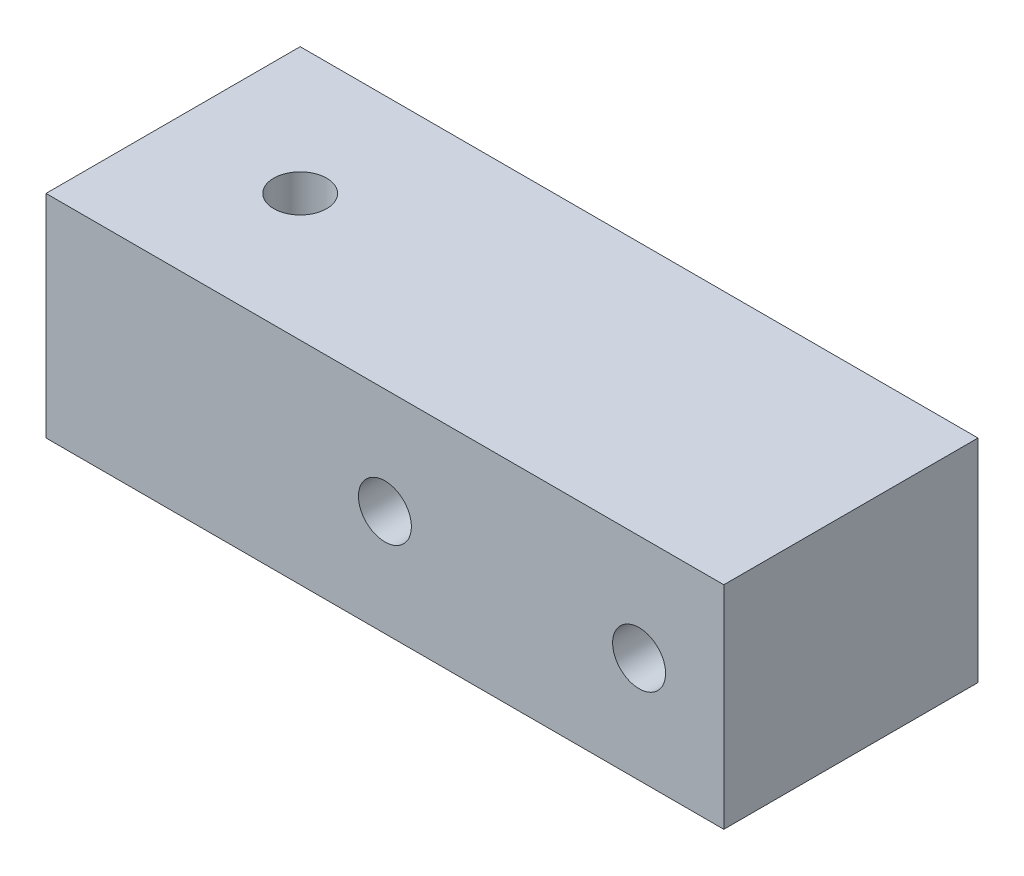
ISO-10303-21;
HEADER;
FILE_DESCRIPTION(('STEP AP214'),'2;1');
FILE_NAME('part.step','',(''),(''),'','','');
FILE_SCHEMA(('AUTOMOTIVE_DESIGN { 1 0 10303 214 1 1 1 1 }'));
ENDSEC;
DATA;
#1=APPLICATION_CONTEXT('core data for automotive mechanical design processes');
#2=APPLICATION_PROTOCOL_DEFINITION('international standard','automotive_design',2000,#1);
#3=PRODUCT_CONTEXT('',#1,'mechanical');
#4=PRODUCT('Part','Part','',(#3));
#5=PRODUCT_RELATED_PRODUCT_CATEGORY('part','',(#4));
#6=PRODUCT_DEFINITION_FORMATION('','',#4);
#7=PRODUCT_DEFINITION_CONTEXT('part definition',#1,'design');
#8=PRODUCT_DEFINITION('design','',#6,#7);
#9=PRODUCT_DEFINITION_SHAPE('','',#8);
#10=(LENGTH_UNIT() NAMED_UNIT(*) SI_UNIT(.MILLI.,.METRE.));
#11=(NAMED_UNIT(*) PLANE_ANGLE_UNIT() SI_UNIT($,.RADIAN.));
#12=(NAMED_UNIT(*) SI_UNIT($,.STERADIAN.) SOLID_ANGLE_UNIT());
#13=UNCERTAINTY_MEASURE_WITH_UNIT(LENGTH_MEASURE(1.E-05),#10,'distance_accuracy_value','');
#14=(GEOMETRIC_REPRESENTATION_CONTEXT(3) GLOBAL_UNCERTAINTY_ASSIGNED_CONTEXT((#13)) GLOBAL_UNIT_ASSIGNED_CONTEXT((#10,
#11,#12)) REPRESENTATION_CONTEXT('',''));
#15=CARTESIAN_POINT('',(0.,0.,0.));
#16=DIRECTION('',(0.,0.,1.));
#17=DIRECTION('',(1.,0.,0.));
#18=AXIS2_PLACEMENT_3D('',#15,#16,#17);
#19=CARTESIAN_POINT('',(0.,10.,0.));
#20=DIRECTION('',(1.,0.,0.));
#21=DIRECTION('',(0.,0.,-1.));
#22=AXIS2_PLACEMENT_3D('',#19,#20,#21);
#23=PLANE('',#22);
#24=DIRECTION('',(0.,0.,1.));
#25=VECTOR('',#24,1.);
#26=CARTESIAN_POINT('',(0.,0.,0.));
#27=LINE('',#26,#25);
#28=CARTESIAN_POINT('',(0.,0.,-12.));
#29=VERTEX_POINT('',#28);
#30=CARTESIAN_POINT('',(0.,0.,0.));
#31=VERTEX_POINT('',#30);
#32=EDGE_CURVE('E102',#29,#31,#27,.T.);
#33=ORIENTED_EDGE('',*,*,#32,.T.);
#34=DIRECTION('',(0.,-1.,0.));
#35=VECTOR('',#34,1.);
#36=CARTESIAN_POINT('',(0.,10.,0.));
#37=LINE('',#36,#35);
#38=CARTESIAN_POINT('',(0.,10.,0.));
#39=VERTEX_POINT('',#38);
#40=EDGE_CURVE('E11',#39,#31,#37,.T.);
#41=ORIENTED_EDGE('',*,*,#40,.F.);
#42=DIRECTION('',(0.,0.,1.));
#43=VECTOR('',#42,1.);
#44=CARTESIAN_POINT('',(0.,10.,0.));
#45=LINE('',#44,#43);
#46=CARTESIAN_POINT('',(0.,10.,-12.));
#47=VERTEX_POINT('',#46);
#48=EDGE_CURVE('E90',#47,#39,#45,.T.);
#49=ORIENTED_EDGE('',*,*,#48,.F.);
#50=DIRECTION('',(0.,-1.,0.));
#51=VECTOR('',#50,1.);
#52=CARTESIAN_POINT('',(0.,10.,-12.));
#53=LINE('',#52,#51);
#54=EDGE_CURVE('E98',#47,#29,#53,.T.);
#55=ORIENTED_EDGE('',*,*,#54,.T.);
#56=EDGE_LOOP('',(#33,#41,#49,#55));
#57=FACE_BOUND('',#56,.T.);
#58=ADVANCED_FACE('F39',(#57),#23,.F.);
#59=CARTESIAN_POINT('',(0.,10.,0.));
#60=DIRECTION('',(0.,0.,-1.));
#61=DIRECTION('',(-1.,0.,0.));
#62=AXIS2_PLACEMENT_3D('',#59,#60,#61);
#63=PLANE('',#62);
#64=CARTESIAN_POINT('',(28.,5.,0.));
#65=DIRECTION('',(0.,0.,1.));
#66=DIRECTION('',(1.,0.,0.));
#67=AXIS2_PLACEMENT_3D('',#64,#65,#66);
#68=CIRCLE('',#67,1.24999999999999);
#69=CARTESIAN_POINT('',(29.25,5.,0.));
#70=VERTEX_POINT('',#69);
#71=EDGE_CURVE('E130',#70,#70,#68,.T.);
#72=ORIENTED_EDGE('',*,*,#71,.F.);
#73=EDGE_LOOP('',(#72));
#74=FACE_BOUND('',#73,.T.);
#75=CARTESIAN_POINT('',(16.,5.,0.));
#76=DIRECTION('',(0.,0.,1.));
#77=DIRECTION('',(1.,0.,0.));
#78=AXIS2_PLACEMENT_3D('',#75,#76,#77);
#79=CIRCLE('',#78,1.24999999999999);
#80=CARTESIAN_POINT('',(17.25,5.,0.));
#81=VERTEX_POINT('',#80);
#82=EDGE_CURVE('E124',#81,#81,#79,.T.);
#83=ORIENTED_EDGE('',*,*,#82,.F.);
#84=EDGE_LOOP('',(#83));
#85=FACE_BOUND('',#84,.T.);
#86=DIRECTION('',(1.,0.,0.));
#87=VECTOR('',#86,1.);
#88=CARTESIAN_POINT('',(0.,0.,0.));
#89=LINE('',#88,#87);
#90=CARTESIAN_POINT('',(32.,0.,0.));
#91=VERTEX_POINT('',#90);
#92=EDGE_CURVE('E94',#31,#91,#89,.T.);
#93=ORIENTED_EDGE('',*,*,#92,.T.);
#94=DIRECTION('',(0.,-1.,0.));
#95=VECTOR('',#94,1.);
#96=CARTESIAN_POINT('',(32.,10.,0.));
#97=LINE('',#96,#95);
#98=CARTESIAN_POINT('',(32.,10.,0.));
#99=VERTEX_POINT('',#98);
#100=EDGE_CURVE('E47',#99,#91,#97,.T.);
#101=ORIENTED_EDGE('',*,*,#100,.F.);
#102=DIRECTION('',(1.,0.,0.));
#103=VECTOR('',#102,1.);
#104=CARTESIAN_POINT('',(0.,10.,0.));
#105=LINE('',#104,#103);
#106=EDGE_CURVE('E85',#39,#99,#105,.T.);
#107=ORIENTED_EDGE('',*,*,#106,.F.);
#108=ORIENTED_EDGE('',*,*,#40,.T.);
#109=EDGE_LOOP('',(#93,#101,#107,#108));
#110=FACE_BOUND('',#109,.T.);
#111=ADVANCED_FACE('F93',(#74,#85,#110),#63,.F.);
#112=CARTESIAN_POINT('',(32.,10.,0.));
#113=DIRECTION('',(-1.,0.,0.));
#114=DIRECTION('',(0.,0.,1.));
#115=AXIS2_PLACEMENT_3D('',#112,#113,#114);
#116=PLANE('',#115);
#117=DIRECTION('',(0.,0.,-1.));
#118=VECTOR('',#117,1.);
#119=CARTESIAN_POINT('',(32.,0.,0.));
#120=LINE('',#119,#118);
#121=CARTESIAN_POINT('',(32.,0.,-12.));
#122=VERTEX_POINT('',#121);
#123=EDGE_CURVE('E72',#91,#122,#120,.T.);
#124=ORIENTED_EDGE('',*,*,#123,.T.);
#125=DIRECTION('',(0.,-1.,0.));
#126=VECTOR('',#125,1.);
#127=CARTESIAN_POINT('',(32.,10.,-12.));
#128=LINE('',#127,#126);
#129=CARTESIAN_POINT('',(32.,10.,-12.));
#130=VERTEX_POINT('',#129);
#131=EDGE_CURVE('E95',#130,#122,#128,.T.);
#132=ORIENTED_EDGE('',*,*,#131,.F.);
#133=DIRECTION('',(0.,0.,-1.));
#134=VECTOR('',#133,1.);
#135=CARTESIAN_POINT('',(32.,10.,0.));
#136=LINE('',#135,#134);
#137=EDGE_CURVE('E88',#99,#130,#136,.T.);
#138=ORIENTED_EDGE('',*,*,#137,.F.);
#139=ORIENTED_EDGE('',*,*,#100,.T.);
#140=EDGE_LOOP('',(#124,#132,#138,#139));
#141=FACE_BOUND('',#140,.T.);
#142=ADVANCED_FACE('F96',(#141),#116,.F.);
#143=CARTESIAN_POINT('',(0.,10.,-12.));
#144=DIRECTION('',(0.,0.,1.));
#145=DIRECTION('',(1.,0.,0.));
#146=AXIS2_PLACEMENT_3D('',#143,#144,#145);
#147=PLANE('',#146);
#148=CARTESIAN_POINT('',(28.,5.,-12.));
#149=DIRECTION('',(0.,0.,1.));
#150=DIRECTION('',(1.,0.,0.));
#151=AXIS2_PLACEMENT_3D('',#148,#149,#150);
#152=CIRCLE('',#151,1.25);
#153=CARTESIAN_POINT('',(29.25,5.,-12.));
#154=VERTEX_POINT('',#153);
#155=EDGE_CURVE('E127',#154,#154,#152,.T.);
#156=ORIENTED_EDGE('',*,*,#155,.T.);
#157=EDGE_LOOP('',(#156));
#158=FACE_BOUND('',#157,.T.);
#159=CARTESIAN_POINT('',(16.,5.,-12.));
#160=DIRECTION('',(0.,0.,1.));
#161=DIRECTION('',(1.,0.,0.));
#162=AXIS2_PLACEMENT_3D('',#159,#160,#161);
#163=CIRCLE('',#162,1.25);
#164=CARTESIAN_POINT('',(17.25,5.,-12.));
#165=VERTEX_POINT('',#164);
#166=EDGE_CURVE('E121',#165,#165,#163,.T.);
#167=ORIENTED_EDGE('',*,*,#166,.T.);
#168=EDGE_LOOP('',(#167));
#169=FACE_BOUND('',#168,.T.);
#170=DIRECTION('',(-1.,0.,0.));
#171=VECTOR('',#170,1.);
#172=CARTESIAN_POINT('',(0.,0.,-12.));
#173=LINE('',#172,#171);
#174=EDGE_CURVE('E78',#122,#29,#173,.T.);
#175=ORIENTED_EDGE('',*,*,#174,.T.);
#176=ORIENTED_EDGE('',*,*,#54,.F.);
#177=DIRECTION('',(-1.,0.,0.));
#178=VECTOR('',#177,1.);
#179=CARTESIAN_POINT('',(0.,10.,-12.));
#180=LINE('',#179,#178);
#181=EDGE_CURVE('E55',#130,#47,#180,.T.);
#182=ORIENTED_EDGE('',*,*,#181,.F.);
#183=ORIENTED_EDGE('',*,*,#131,.T.);
#184=EDGE_LOOP('',(#175,#176,#182,#183));
#185=FACE_BOUND('',#184,.T.);
#186=ADVANCED_FACE('F110',(#158,#169,#185),#147,.F.);
#187=CARTESIAN_POINT('',(0.,10.,0.));
#188=DIRECTION('',(0.,-1.,0.));
#189=DIRECTION('',(0.,0.,-1.));
#190=AXIS2_PLACEMENT_3D('',#187,#188,#189);
#191=PLANE('',#190);
#192=CARTESIAN_POINT('',(6.,10.,-6.));
#193=DIRECTION('',(0.,1.,0.));
#194=DIRECTION('',(0.,0.,1.));
#195=AXIS2_PLACEMENT_3D('',#192,#193,#194);
#196=CIRCLE('',#195,1.25);
#197=CARTESIAN_POINT('',(6.,10.,-4.75));
#198=VERTEX_POINT('',#197);
#199=EDGE_CURVE('E118',#198,#198,#196,.T.);
#200=ORIENTED_EDGE('',*,*,#199,.F.);
#201=EDGE_LOOP('',(#200));
#202=FACE_BOUND('',#201,.T.);
#203=ORIENTED_EDGE('',*,*,#48,.T.);
#204=ORIENTED_EDGE('',*,*,#106,.T.);
#205=ORIENTED_EDGE('',*,*,#137,.T.);
#206=ORIENTED_EDGE('',*,*,#181,.T.);
#207=EDGE_LOOP('',(#203,#204,#205,#206));
#208=FACE_BOUND('',#207,.T.);
#209=ADVANCED_FACE('F86',(#202,#208),#191,.F.);
#210=CARTESIAN_POINT('',(0.,0.,0.));
#211=DIRECTION('',(0.,-1.,0.));
#212=DIRECTION('',(0.,0.,-1.));
#213=AXIS2_PLACEMENT_3D('',#210,#211,#212);
#214=PLANE('',#213);
#215=CARTESIAN_POINT('',(6.,0.,-6.));
#216=DIRECTION('',(0.,1.,0.));
#217=DIRECTION('',(0.,0.,1.));
#218=AXIS2_PLACEMENT_3D('',#215,#216,#217);
#219=CIRCLE('',#218,1.25);
#220=CARTESIAN_POINT('',(6.,0.,-4.75));
#221=VERTEX_POINT('',#220);
#222=EDGE_CURVE('E105',#221,#221,#219,.T.);
#223=ORIENTED_EDGE('',*,*,#222,.T.);
#224=EDGE_LOOP('',(#223));
#225=FACE_BOUND('',#224,.T.);
#226=ORIENTED_EDGE('',*,*,#32,.F.);
#227=ORIENTED_EDGE('',*,*,#174,.F.);
#228=ORIENTED_EDGE('',*,*,#123,.F.);
#229=ORIENTED_EDGE('',*,*,#92,.F.);
#230=EDGE_LOOP('',(#226,#227,#228,#229));
#231=FACE_BOUND('',#230,.T.);
#232=ADVANCED_FACE('F113',(#225,#231),#214,.T.);
#233=CARTESIAN_POINT('',(6.,10.,-6.));
#234=DIRECTION('',(0.,1.,0.));
#235=DIRECTION('',(0.,0.,1.));
#236=AXIS2_PLACEMENT_3D('',#233,#234,#235);
#237=CYLINDRICAL_SURFACE('',#236,1.25);
#238=ORIENTED_EDGE('',*,*,#222,.F.);
#239=EDGE_LOOP('',(#238));
#240=FACE_BOUND('',#239,.T.);
#241=ORIENTED_EDGE('',*,*,#199,.T.);
#242=EDGE_LOOP('',(#241));
#243=FACE_BOUND('',#242,.T.);
#244=ADVANCED_FACE('F142',(#240,#243),#237,.F.);
#245=CARTESIAN_POINT('',(16.,5.,0.));
#246=DIRECTION('',(0.,0.,1.));
#247=DIRECTION('',(1.,0.,0.));
#248=AXIS2_PLACEMENT_3D('',#245,#246,#247);
#249=CYLINDRICAL_SURFACE('',#248,1.24999999999999);
#250=ORIENTED_EDGE('',*,*,#166,.F.);
#251=EDGE_LOOP('',(#250));
#252=FACE_BOUND('',#251,.T.);
#253=ORIENTED_EDGE('',*,*,#82,.T.);
#254=EDGE_LOOP('',(#253));
#255=FACE_BOUND('',#254,.T.);
#256=ADVANCED_FACE('F140',(#252,#255),#249,.F.);
#257=CARTESIAN_POINT('',(28.,5.,0.));
#258=DIRECTION('',(0.,0.,1.));
#259=DIRECTION('',(1.,0.,0.));
#260=AXIS2_PLACEMENT_3D('',#257,#258,#259);
#261=CYLINDRICAL_SURFACE('',#260,1.24999999999999);
#262=ORIENTED_EDGE('',*,*,#155,.F.);
#263=EDGE_LOOP('',(#262));
#264=FACE_BOUND('',#263,.T.);
#265=ORIENTED_EDGE('',*,*,#71,.T.);
#266=EDGE_LOOP('',(#265));
#267=FACE_BOUND('',#266,.T.);
#268=ADVANCED_FACE('F134',(#264,#267),#261,.F.);
#269=CLOSED_SHELL('',(#58,#111,#142,#186,#209,#232,#244,#256,#268));
#270=MANIFOLD_SOLID_BREP('B2',#269);
#271=ADVANCED_BREP_SHAPE_REPRESENTATION('',(#18,#270),#14);
#272=SHAPE_DEFINITION_REPRESENTATION(#9,#271);
ENDSEC;
END-ISO-10303-21;
